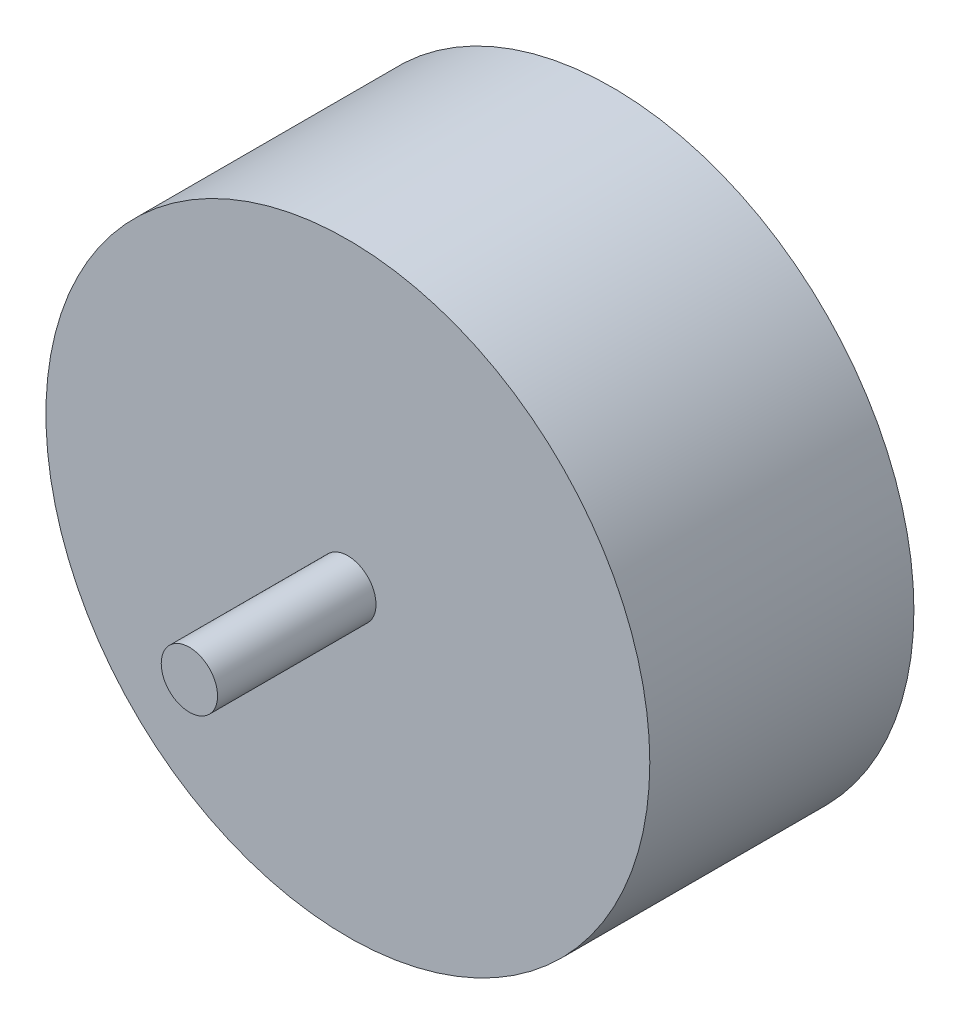
ISO-10303-21;
HEADER;
FILE_DESCRIPTION(('STEP AP214'),'2;1');
FILE_NAME('part.step','',(''),(''),'','','');
FILE_SCHEMA(('AUTOMOTIVE_DESIGN { 1 0 10303 214 1 1 1 1 }'));
ENDSEC;
DATA;
#1=APPLICATION_CONTEXT('core data for automotive mechanical design processes');
#2=APPLICATION_PROTOCOL_DEFINITION('international standard','automotive_design',2000,#1);
#3=PRODUCT_CONTEXT('',#1,'mechanical');
#4=PRODUCT('Part','Part','',(#3));
#5=PRODUCT_RELATED_PRODUCT_CATEGORY('part','',(#4));
#6=PRODUCT_DEFINITION_FORMATION('','',#4);
#7=PRODUCT_DEFINITION_CONTEXT('part definition',#1,'design');
#8=PRODUCT_DEFINITION('design','',#6,#7);
#9=PRODUCT_DEFINITION_SHAPE('','',#8);
#10=(LENGTH_UNIT() NAMED_UNIT(*) SI_UNIT(.MILLI.,.METRE.));
#11=(NAMED_UNIT(*) PLANE_ANGLE_UNIT() SI_UNIT($,.RADIAN.));
#12=(NAMED_UNIT(*) SI_UNIT($,.STERADIAN.) SOLID_ANGLE_UNIT());
#13=UNCERTAINTY_MEASURE_WITH_UNIT(LENGTH_MEASURE(1.E-05),#10,'distance_accuracy_value','');
#14=(GEOMETRIC_REPRESENTATION_CONTEXT(3) GLOBAL_UNCERTAINTY_ASSIGNED_CONTEXT((#13)) GLOBAL_UNIT_ASSIGNED_CONTEXT((#10,
#11,#12)) REPRESENTATION_CONTEXT('',''));
#15=CARTESIAN_POINT('',(0.,0.,0.));
#16=DIRECTION('',(0.,0.,1.));
#17=DIRECTION('',(1.,0.,0.));
#18=AXIS2_PLACEMENT_3D('',#15,#16,#17);
#19=CARTESIAN_POINT('',(0.,0.,75.));
#20=DIRECTION('',(0.,0.,-1.));
#21=DIRECTION('',(-1.,0.,0.));
#22=AXIS2_PLACEMENT_3D('',#19,#20,#21);
#23=CYLINDRICAL_SURFACE('',#22,85.75);
#24=CARTESIAN_POINT('',(0.,0.,75.));
#25=DIRECTION('',(0.,0.,1.));
#26=DIRECTION('',(1.,0.,0.));
#27=AXIS2_PLACEMENT_3D('',#24,#25,#26);
#28=CIRCLE('',#27,85.75);
#29=CARTESIAN_POINT('',(85.75,0.,75.));
#30=VERTEX_POINT('',#29);
#31=EDGE_CURVE('E10',#30,#30,#28,.T.);
#32=ORIENTED_EDGE('',*,*,#31,.F.);
#33=EDGE_LOOP('',(#32));
#34=FACE_BOUND('',#33,.T.);
#35=CARTESIAN_POINT('',(0.,0.,0.));
#36=DIRECTION('',(0.,0.,1.));
#37=DIRECTION('',(1.,0.,0.));
#38=AXIS2_PLACEMENT_3D('',#35,#36,#37);
#39=CIRCLE('',#38,85.75);
#40=CARTESIAN_POINT('',(85.75,0.,0.));
#41=VERTEX_POINT('',#40);
#42=EDGE_CURVE('E34',#41,#41,#39,.T.);
#43=ORIENTED_EDGE('',*,*,#42,.T.);
#44=EDGE_LOOP('',(#43));
#45=FACE_BOUND('',#44,.T.);
#46=ADVANCED_FACE('F31',(#34,#45),#23,.T.);
#47=CARTESIAN_POINT('',(0.,0.,75.));
#48=DIRECTION('',(0.,0.,1.));
#49=DIRECTION('',(1.,0.,0.));
#50=AXIS2_PLACEMENT_3D('',#47,#48,#49);
#51=PLANE('',#50);
#52=CARTESIAN_POINT('',(0.,0.,75.));
#53=DIRECTION('',(0.,0.,1.));
#54=DIRECTION('',(1.,0.,0.));
#55=AXIS2_PLACEMENT_3D('',#52,#53,#54);
#56=CIRCLE('',#55,8.);
#57=CARTESIAN_POINT('',(-8.,0.,75.));
#58=VERTEX_POINT('',#57);
#59=EDGE_CURVE('E43',#58,#58,#56,.T.);
#60=ORIENTED_EDGE('',*,*,#59,.F.);
#61=EDGE_LOOP('',(#60));
#62=FACE_BOUND('',#61,.T.);
#63=ORIENTED_EDGE('',*,*,#31,.T.);
#64=EDGE_LOOP('',(#63));
#65=FACE_BOUND('',#64,.T.);
#66=ADVANCED_FACE('F58',(#62,#65),#51,.T.);
#67=CARTESIAN_POINT('',(0.,0.,0.));
#68=DIRECTION('',(0.,0.,1.));
#69=DIRECTION('',(1.,0.,0.));
#70=AXIS2_PLACEMENT_3D('',#67,#68,#69);
#71=PLANE('',#70);
#72=ORIENTED_EDGE('',*,*,#42,.F.);
#73=EDGE_LOOP('',(#72));
#74=FACE_BOUND('',#73,.T.);
#75=ADVANCED_FACE('F54',(#74),#71,.F.);
#76=CARTESIAN_POINT('',(0.,0.,120.));
#77=DIRECTION('',(0.,0.,-1.));
#78=DIRECTION('',(-1.,0.,0.));
#79=AXIS2_PLACEMENT_3D('',#76,#77,#78);
#80=CYLINDRICAL_SURFACE('',#79,8.);
#81=CARTESIAN_POINT('',(0.,0.,120.));
#82=DIRECTION('',(0.,0.,1.));
#83=DIRECTION('',(1.,0.,0.));
#84=AXIS2_PLACEMENT_3D('',#81,#82,#83);
#85=CIRCLE('',#84,8.);
#86=CARTESIAN_POINT('',(-8.,0.,120.));
#87=VERTEX_POINT('',#86);
#88=EDGE_CURVE('E41',#87,#87,#85,.T.);
#89=CARTESIAN_POINT('',(-8.,0.,120.));
#90=CARTESIAN_POINT('',(-8.,0.,119.53125));
#91=CARTESIAN_POINT('',(-8.,0.,119.0625));
#92=CARTESIAN_POINT('',(-8.,0.,118.125));
#93=CARTESIAN_POINT('',(-8.,0.,117.65625));
#94=CARTESIAN_POINT('',(-8.,0.,116.71875));
#95=CARTESIAN_POINT('',(-8.,0.,116.25));
#96=CARTESIAN_POINT('',(-8.,0.,115.3125));
#97=CARTESIAN_POINT('',(-8.,0.,114.84375));
#98=CARTESIAN_POINT('',(-8.,0.,113.90625));
#99=CARTESIAN_POINT('',(-8.,0.,113.4375));
#100=CARTESIAN_POINT('',(-8.,0.,112.5));
#101=CARTESIAN_POINT('',(-8.,0.,112.03125));
#102=CARTESIAN_POINT('',(-8.,0.,111.09375));
#103=CARTESIAN_POINT('',(-8.,0.,110.625));
#104=CARTESIAN_POINT('',(-8.,0.,109.6875));
#105=CARTESIAN_POINT('',(-8.,0.,109.21875));
#106=CARTESIAN_POINT('',(-8.,0.,108.28125));
#107=CARTESIAN_POINT('',(-8.,0.,107.8125));
#108=CARTESIAN_POINT('',(-8.,0.,106.875));
#109=CARTESIAN_POINT('',(-8.,0.,106.40625));
#110=CARTESIAN_POINT('',(-8.,0.,105.46875));
#111=CARTESIAN_POINT('',(-8.,0.,105.));
#112=CARTESIAN_POINT('',(-8.,0.,104.0625));
#113=CARTESIAN_POINT('',(-8.,0.,103.59375));
#114=CARTESIAN_POINT('',(-8.,0.,102.65625));
#115=CARTESIAN_POINT('',(-8.,0.,102.1875));
#116=CARTESIAN_POINT('',(-8.,0.,101.25));
#117=CARTESIAN_POINT('',(-8.,0.,100.78125));
#118=CARTESIAN_POINT('',(-8.,0.,99.84375));
#119=CARTESIAN_POINT('',(-8.,0.,99.375));
#120=CARTESIAN_POINT('',(-8.,0.,98.4375));
#121=CARTESIAN_POINT('',(-8.,0.,97.96875));
#122=CARTESIAN_POINT('',(-8.,0.,97.03125));
#123=CARTESIAN_POINT('',(-8.,0.,96.5625));
#124=CARTESIAN_POINT('',(-8.,0.,95.625));
#125=CARTESIAN_POINT('',(-8.,0.,95.15625));
#126=CARTESIAN_POINT('',(-8.,0.,94.21875));
#127=CARTESIAN_POINT('',(-8.,0.,93.75));
#128=CARTESIAN_POINT('',(-8.,0.,92.8125));
#129=CARTESIAN_POINT('',(-8.,0.,92.34375));
#130=CARTESIAN_POINT('',(-8.,0.,91.40625));
#131=CARTESIAN_POINT('',(-8.,0.,90.9375));
#132=CARTESIAN_POINT('',(-8.,0.,90.));
#133=CARTESIAN_POINT('',(-8.,0.,89.53125));
#134=CARTESIAN_POINT('',(-8.,0.,88.59375));
#135=CARTESIAN_POINT('',(-8.,0.,88.125));
#136=CARTESIAN_POINT('',(-8.,0.,87.1875));
#137=CARTESIAN_POINT('',(-8.,0.,86.71875));
#138=CARTESIAN_POINT('',(-8.,0.,85.78125));
#139=CARTESIAN_POINT('',(-8.,0.,85.3125));
#140=CARTESIAN_POINT('',(-8.,0.,84.375));
#141=CARTESIAN_POINT('',(-8.,0.,83.90625));
#142=CARTESIAN_POINT('',(-8.,0.,82.96875));
#143=CARTESIAN_POINT('',(-8.,0.,82.5));
#144=CARTESIAN_POINT('',(-8.,0.,81.5625));
#145=CARTESIAN_POINT('',(-8.,0.,81.09375));
#146=CARTESIAN_POINT('',(-8.,0.,80.15625));
#147=CARTESIAN_POINT('',(-8.,0.,79.6875));
#148=CARTESIAN_POINT('',(-8.,0.,78.75));
#149=CARTESIAN_POINT('',(-8.,0.,78.28125));
#150=CARTESIAN_POINT('',(-8.,0.,77.34375));
#151=CARTESIAN_POINT('',(-8.,0.,76.875));
#152=CARTESIAN_POINT('',(-8.,0.,75.9375));
#153=CARTESIAN_POINT('',(-8.,0.,75.46875));
#154=CARTESIAN_POINT('',(-8.,0.,75.));
#155=B_SPLINE_CURVE_WITH_KNOTS('',3,(#89,#90,#91,#92,#93,#94,#95,#96,#97,#98,#99,#100,#101,#102,
#103,#104,#105,#106,#107,#108,#109,#110,#111,#112,#113,#114,#115,#116,#117,#118,#119,#120,#121,
#122,#123,#124,#125,#126,#127,#128,#129,#130,#131,#132,#133,#134,#135,#136,#137,#138,#139,#140,
#141,#142,#143,#144,#145,#146,#147,#148,#149,#150,#151,#152,#153,#154),.UNSPECIFIED.,.F.,.F.,(4,
2,2,2,2,2,2,2,2,2,2,2,2,2,2,2,2,2,2,2,2,2,2,2,2,2,2,2,2,2,2,2,4),(0.,1.40625,2.8125,
4.21874999999999,5.62499999999999,7.03124999999999,8.43749999999999,9.84375,11.25,12.65625,
14.0625,15.46875,16.875,18.28125,19.6875,21.09375,22.5,23.90625,25.3125,26.71875,28.125,
29.53125,30.9375,32.34375,33.75,35.15625,36.5625,37.96875,39.375,40.78125,42.1875,43.59375,45.),.UNSPECIFIED.);
#156=EDGE_CURVE('BSEAM51',#87,#58,#155,.T.);
#157=ORIENTED_EDGE('',*,*,#88,.F.);
#158=ORIENTED_EDGE('',*,*,#59,.T.);
#159=ORIENTED_EDGE('',*,*,#156,.T.);
#160=ORIENTED_EDGE('',*,*,#156,.F.);
#161=EDGE_LOOP('',(#157,#159,#158,#160));
#162=FACE_BOUND('',#161,.T.);
#163=ADVANCED_FACE('F51',(#162),#80,.T.);
#164=CARTESIAN_POINT('',(0.,0.,120.));
#165=DIRECTION('',(0.,0.,1.));
#166=DIRECTION('',(1.,0.,0.));
#167=AXIS2_PLACEMENT_3D('',#164,#165,#166);
#168=PLANE('',#167);
#169=ORIENTED_EDGE('',*,*,#88,.T.);
#170=EDGE_LOOP('',(#169));
#171=FACE_BOUND('',#170,.T.);
#172=ADVANCED_FACE('F49',(#171),#168,.T.);
#173=CLOSED_SHELL('',(#46,#66,#75,#163,#172));
#174=MANIFOLD_SOLID_BREP('B2',#173);
#175=ADVANCED_BREP_SHAPE_REPRESENTATION('',(#18,#174),#14);
#176=SHAPE_DEFINITION_REPRESENTATION(#9,#175);
ENDSEC;
END-ISO-10303-21;
